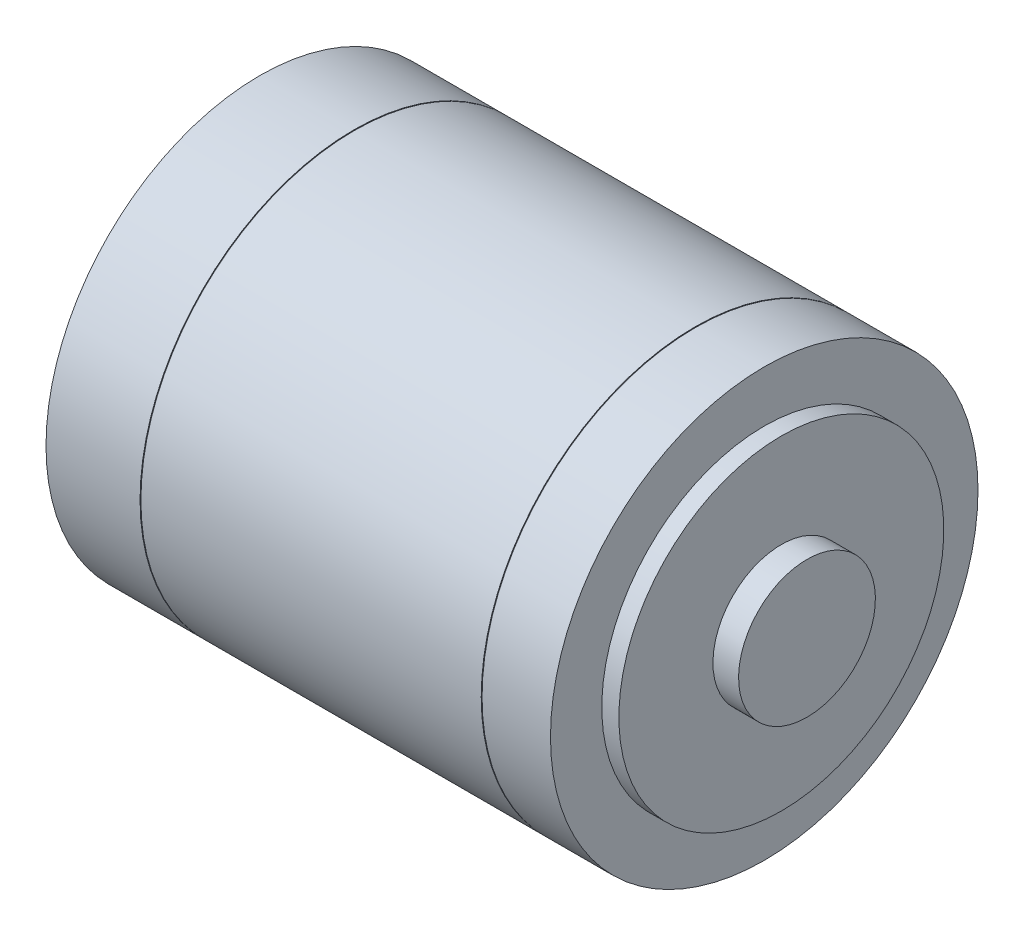
ISO-10303-21;
HEADER;
FILE_DESCRIPTION(('STEP AP214'),'2;1');
FILE_NAME('part.step','',(''),(''),'','','');
FILE_SCHEMA(('AUTOMOTIVE_DESIGN { 1 0 10303 214 1 1 1 1 }'));
ENDSEC;
DATA;
#1=APPLICATION_CONTEXT('core data for automotive mechanical design processes');
#2=APPLICATION_PROTOCOL_DEFINITION('international standard','automotive_design',2000,#1);
#3=PRODUCT_CONTEXT('',#1,'mechanical');
#4=PRODUCT('Part','Part','',(#3));
#5=PRODUCT_RELATED_PRODUCT_CATEGORY('part','',(#4));
#6=PRODUCT_DEFINITION_FORMATION('','',#4);
#7=PRODUCT_DEFINITION_CONTEXT('part definition',#1,'design');
#8=PRODUCT_DEFINITION('design','',#6,#7);
#9=PRODUCT_DEFINITION_SHAPE('','',#8);
#10=(LENGTH_UNIT() NAMED_UNIT(*) SI_UNIT(.MILLI.,.METRE.));
#11=(NAMED_UNIT(*) PLANE_ANGLE_UNIT() SI_UNIT($,.RADIAN.));
#12=(NAMED_UNIT(*) SI_UNIT($,.STERADIAN.) SOLID_ANGLE_UNIT());
#13=UNCERTAINTY_MEASURE_WITH_UNIT(LENGTH_MEASURE(1.E-05),#10,'distance_accuracy_value','');
#14=(GEOMETRIC_REPRESENTATION_CONTEXT(3) GLOBAL_UNCERTAINTY_ASSIGNED_CONTEXT((#13)) GLOBAL_UNIT_ASSIGNED_CONTEXT((#10,
#11,#12)) REPRESENTATION_CONTEXT('',''));
#15=CARTESIAN_POINT('',(0.,0.,0.));
#16=DIRECTION('',(0.,0.,1.));
#17=DIRECTION('',(1.,0.,0.));
#18=AXIS2_PLACEMENT_3D('',#15,#16,#17);
#19=CARTESIAN_POINT('',(-64.,15.,0.));
#20=DIRECTION('',(1.,0.,0.));
#21=DIRECTION('',(0.,1.,0.));
#22=AXIS2_PLACEMENT_3D('',#19,#20,#21);
#23=PLANE('',#22);
#24=CARTESIAN_POINT('',(-64.,-9.99999999999983,-17.3205080756889));
#25=DIRECTION('',(-1.,0.,0.));
#26=DIRECTION('',(0.,0.,1.));
#27=AXIS2_PLACEMENT_3D('',#24,#25,#26);
#28=CIRCLE('',#27,2.09999999999999);
#29=CARTESIAN_POINT('',(-64.,-9.99999999999983,-15.2205080756889));
#30=VERTEX_POINT('',#29);
#31=EDGE_CURVE('E83',#30,#30,#28,.T.);
#32=ORIENTED_EDGE('',*,*,#31,.F.);
#33=EDGE_LOOP('',(#32));
#34=FACE_BOUND('',#33,.T.);
#35=CARTESIAN_POINT('',(-64.,-10.0000000000001,17.3205080756888));
#36=DIRECTION('',(-1.,0.,0.));
#37=DIRECTION('',(0.,0.,1.));
#38=AXIS2_PLACEMENT_3D('',#35,#36,#37);
#39=CIRCLE('',#38,2.09999999999999);
#40=CARTESIAN_POINT('',(-64.,-10.0000000000001,19.4205080756888));
#41=VERTEX_POINT('',#40);
#42=EDGE_CURVE('E95',#41,#41,#39,.T.);
#43=ORIENTED_EDGE('',*,*,#42,.F.);
#44=EDGE_LOOP('',(#43));
#45=FACE_BOUND('',#44,.T.);
#46=CARTESIAN_POINT('',(-64.,0.,0.));
#47=DIRECTION('',(-1.,0.,0.));
#48=DIRECTION('',(0.,-1.,0.));
#49=AXIS2_PLACEMENT_3D('',#46,#47,#48);
#50=CIRCLE('',#49,25.);
#51=CARTESIAN_POINT('',(-64.,-25.,0.));
#52=VERTEX_POINT('',#51);
#53=EDGE_CURVE('E113',#52,#52,#50,.T.);
#54=ORIENTED_EDGE('',*,*,#53,.T.);
#55=EDGE_LOOP('',(#54));
#56=FACE_BOUND('',#55,.T.);
#57=CARTESIAN_POINT('',(-64.,0.,0.));
#58=DIRECTION('',(-1.,0.,0.));
#59=DIRECTION('',(0.,-1.,0.));
#60=AXIS2_PLACEMENT_3D('',#57,#58,#59);
#61=CIRCLE('',#60,15.);
#62=CARTESIAN_POINT('',(-64.,-15.,0.));
#63=VERTEX_POINT('',#62);
#64=EDGE_CURVE('E110',#63,#63,#61,.T.);
#65=ORIENTED_EDGE('',*,*,#64,.F.);
#66=EDGE_LOOP('',(#65));
#67=FACE_BOUND('',#66,.T.);
#68=CARTESIAN_POINT('',(-64.,20.,0.));
#69=DIRECTION('',(-1.,0.,0.));
#70=DIRECTION('',(0.,0.,1.));
#71=AXIS2_PLACEMENT_3D('',#68,#69,#70);
#72=CIRCLE('',#71,2.09999999999999);
#73=CARTESIAN_POINT('',(-64.,20.,2.10000000000001));
#74=VERTEX_POINT('',#73);
#75=EDGE_CURVE('E107',#74,#74,#72,.T.);
#76=ORIENTED_EDGE('',*,*,#75,.F.);
#77=EDGE_LOOP('',(#76));
#78=FACE_BOUND('',#77,.T.);
#79=CARTESIAN_POINT('',(-64.,9.99999999999995,17.3205080756889));
#80=DIRECTION('',(-1.,0.,0.));
#81=DIRECTION('',(0.,0.,1.));
#82=AXIS2_PLACEMENT_3D('',#79,#80,#81);
#83=CIRCLE('',#82,2.09999999999999);
#84=CARTESIAN_POINT('',(-64.,9.99999999999995,19.4205080756889));
#85=VERTEX_POINT('',#84);
#86=EDGE_CURVE('E101',#85,#85,#83,.T.);
#87=ORIENTED_EDGE('',*,*,#86,.F.);
#88=EDGE_LOOP('',(#87));
#89=FACE_BOUND('',#88,.T.);
#90=CARTESIAN_POINT('',(-64.,-20.,-1.37643350067595E-13));
#91=DIRECTION('',(-1.,0.,0.));
#92=DIRECTION('',(0.,0.,1.));
#93=AXIS2_PLACEMENT_3D('',#90,#91,#92);
#94=CIRCLE('',#93,2.09999999999999);
#95=CARTESIAN_POINT('',(-64.,-20.,2.09999999999986));
#96=VERTEX_POINT('',#95);
#97=EDGE_CURVE('E89',#96,#96,#94,.T.);
#98=ORIENTED_EDGE('',*,*,#97,.F.);
#99=EDGE_LOOP('',(#98));
#100=FACE_BOUND('',#99,.T.);
#101=CARTESIAN_POINT('',(-64.,10.0000000000002,-17.3205080756887));
#102=DIRECTION('',(-1.,0.,0.));
#103=DIRECTION('',(0.,0.,1.));
#104=AXIS2_PLACEMENT_3D('',#101,#102,#103);
#105=CIRCLE('',#104,2.09999999999999);
#106=CARTESIAN_POINT('',(-64.,10.0000000000002,-15.2205080756887));
#107=VERTEX_POINT('',#106);
#108=EDGE_CURVE('E75',#107,#107,#105,.T.);
#109=ORIENTED_EDGE('',*,*,#108,.F.);
#110=EDGE_LOOP('',(#109));
#111=FACE_BOUND('',#110,.T.);
#112=ADVANCED_FACE('F37',(#34,#45,#56,#67,#78,#89,#100,#111),#23,.F.);
#113=CARTESIAN_POINT('',(0.,8.00000000000001,0.));
#114=DIRECTION('',(-1.,0.,0.));
#115=DIRECTION('',(0.,-1.,0.));
#116=AXIS2_PLACEMENT_3D('',#113,#114,#115);
#117=PLANE('',#116);
#118=CARTESIAN_POINT('',(0.,0.,0.));
#119=DIRECTION('',(-1.,0.,0.));
#120=DIRECTION('',(0.,-1.,0.));
#121=AXIS2_PLACEMENT_3D('',#118,#119,#120);
#122=CIRCLE('',#121,8.);
#123=CARTESIAN_POINT('',(0.,-8.,0.));
#124=VERTEX_POINT('',#123);
#125=EDGE_CURVE('E152',#124,#124,#122,.T.);
#126=ORIENTED_EDGE('',*,*,#125,.F.);
#127=EDGE_LOOP('',(#126));
#128=FACE_BOUND('',#127,.T.);
#129=ADVANCED_FACE('F197',(#128),#117,.F.);
#130=CARTESIAN_POINT('',(-92.,0.,0.));
#131=DIRECTION('',(-1.,0.,0.));
#132=DIRECTION('',(0.,-1.,0.));
#133=AXIS2_PLACEMENT_3D('',#130,#131,#132);
#134=CYLINDRICAL_SURFACE('',#133,8.);
#135=CARTESIAN_POINT('',(-3.,0.,0.));
#136=DIRECTION('',(-1.,0.,0.));
#137=DIRECTION('',(0.,-1.,0.));
#138=AXIS2_PLACEMENT_3D('',#135,#136,#137);
#139=CIRCLE('',#138,8.);
#140=CARTESIAN_POINT('',(-2.99999999999999,-8.,0.));
#141=VERTEX_POINT('',#140);
#142=EDGE_CURVE('E149',#141,#141,#139,.T.);
#143=ORIENTED_EDGE('',*,*,#142,.F.);
#144=EDGE_LOOP('',(#143));
#145=FACE_BOUND('',#144,.T.);
#146=ORIENTED_EDGE('',*,*,#125,.T.);
#147=EDGE_LOOP('',(#146));
#148=FACE_BOUND('',#147,.T.);
#149=ADVANCED_FACE('F203',(#145,#148),#134,.T.);
#150=CARTESIAN_POINT('',(-3.,19.,0.));
#151=DIRECTION('',(-1.,0.,0.));
#152=DIRECTION('',(0.,-1.,0.));
#153=AXIS2_PLACEMENT_3D('',#150,#151,#152);
#154=PLANE('',#153);
#155=CARTESIAN_POINT('',(-3.,0.,0.));
#156=DIRECTION('',(-1.,0.,0.));
#157=DIRECTION('',(0.,-1.,0.));
#158=AXIS2_PLACEMENT_3D('',#155,#156,#157);
#159=CIRCLE('',#158,19.);
#160=CARTESIAN_POINT('',(-2.99999999999998,-19.,0.));
#161=VERTEX_POINT('',#160);
#162=EDGE_CURVE('E146',#161,#161,#159,.T.);
#163=ORIENTED_EDGE('',*,*,#162,.F.);
#164=EDGE_LOOP('',(#163));
#165=FACE_BOUND('',#164,.T.);
#166=ORIENTED_EDGE('',*,*,#142,.T.);
#167=EDGE_LOOP('',(#166));
#168=FACE_BOUND('',#167,.T.);
#169=ADVANCED_FACE('F255',(#165,#168),#154,.F.);
#170=CARTESIAN_POINT('',(-92.,0.,0.));
#171=DIRECTION('',(-1.,0.,0.));
#172=DIRECTION('',(0.,-1.,0.));
#173=AXIS2_PLACEMENT_3D('',#170,#171,#172);
#174=CYLINDRICAL_SURFACE('',#173,19.);
#175=CARTESIAN_POINT('',(-5.,0.,0.));
#176=DIRECTION('',(-1.,0.,0.));
#177=DIRECTION('',(0.,-1.,0.));
#178=AXIS2_PLACEMENT_3D('',#175,#176,#177);
#179=CIRCLE('',#178,19.);
#180=CARTESIAN_POINT('',(-4.99999999999998,-19.,0.));
#181=VERTEX_POINT('',#180);
#182=EDGE_CURVE('E143',#181,#181,#179,.T.);
#183=ORIENTED_EDGE('',*,*,#182,.F.);
#184=EDGE_LOOP('',(#183));
#185=FACE_BOUND('',#184,.T.);
#186=ORIENTED_EDGE('',*,*,#162,.T.);
#187=EDGE_LOOP('',(#186));
#188=FACE_BOUND('',#187,.T.);
#189=ADVANCED_FACE('F251',(#185,#188),#174,.T.);
#190=CARTESIAN_POINT('',(-5.,25.,0.));
#191=DIRECTION('',(-1.,0.,0.));
#192=DIRECTION('',(0.,-1.,0.));
#193=AXIS2_PLACEMENT_3D('',#190,#191,#192);
#194=PLANE('',#193);
#195=CARTESIAN_POINT('',(-5.,0.,0.));
#196=DIRECTION('',(-1.,0.,0.));
#197=DIRECTION('',(0.,-1.,0.));
#198=AXIS2_PLACEMENT_3D('',#195,#196,#197);
#199=CIRCLE('',#198,25.);
#200=CARTESIAN_POINT('',(-4.99999999999998,-25.,0.));
#201=VERTEX_POINT('',#200);
#202=EDGE_CURVE('E140',#201,#201,#199,.T.);
#203=ORIENTED_EDGE('',*,*,#202,.F.);
#204=EDGE_LOOP('',(#203));
#205=FACE_BOUND('',#204,.T.);
#206=ORIENTED_EDGE('',*,*,#182,.T.);
#207=EDGE_LOOP('',(#206));
#208=FACE_BOUND('',#207,.T.);
#209=ADVANCED_FACE('F247',(#205,#208),#194,.F.);
#210=CARTESIAN_POINT('',(-92.,0.,0.));
#211=DIRECTION('',(-1.,0.,0.));
#212=DIRECTION('',(0.,-1.,0.));
#213=AXIS2_PLACEMENT_3D('',#210,#211,#212);
#214=CYLINDRICAL_SURFACE('',#213,25.);
#215=CARTESIAN_POINT('',(-13.,0.,0.));
#216=DIRECTION('',(-1.,0.,0.));
#217=DIRECTION('',(0.,-1.,0.));
#218=AXIS2_PLACEMENT_3D('',#215,#216,#217);
#219=CIRCLE('',#218,25.);
#220=CARTESIAN_POINT('',(-13.,-25.,0.));
#221=VERTEX_POINT('',#220);
#222=EDGE_CURVE('E137',#221,#221,#219,.T.);
#223=ORIENTED_EDGE('',*,*,#222,.F.);
#224=EDGE_LOOP('',(#223));
#225=FACE_BOUND('',#224,.T.);
#226=ORIENTED_EDGE('',*,*,#202,.T.);
#227=EDGE_LOOP('',(#226));
#228=FACE_BOUND('',#227,.T.);
#229=ADVANCED_FACE('F243',(#225,#228),#214,.T.);
#230=CARTESIAN_POINT('',(-13.,24.9,0.));
#231=DIRECTION('',(1.,0.,0.));
#232=DIRECTION('',(0.,1.,0.));
#233=AXIS2_PLACEMENT_3D('',#230,#231,#232);
#234=PLANE('',#233);
#235=CARTESIAN_POINT('',(-13.,0.,0.));
#236=DIRECTION('',(-1.,0.,0.));
#237=DIRECTION('',(0.,-1.,0.));
#238=AXIS2_PLACEMENT_3D('',#235,#236,#237);
#239=CIRCLE('',#238,24.9);
#240=CARTESIAN_POINT('',(-13.,-24.9,0.));
#241=VERTEX_POINT('',#240);
#242=EDGE_CURVE('E134',#241,#241,#239,.T.);
#243=ORIENTED_EDGE('',*,*,#242,.F.);
#244=EDGE_LOOP('',(#243));
#245=FACE_BOUND('',#244,.T.);
#246=ORIENTED_EDGE('',*,*,#222,.T.);
#247=EDGE_LOOP('',(#246));
#248=FACE_BOUND('',#247,.T.);
#249=ADVANCED_FACE('F239',(#245,#248),#234,.F.);
#250=CARTESIAN_POINT('',(-92.,0.,0.));
#251=DIRECTION('',(-1.,0.,0.));
#252=DIRECTION('',(0.,-1.,0.));
#253=AXIS2_PLACEMENT_3D('',#250,#251,#252);
#254=CYLINDRICAL_SURFACE('',#253,24.9);
#255=CARTESIAN_POINT('',(-13.1,0.,0.));
#256=DIRECTION('',(-1.,0.,0.));
#257=DIRECTION('',(0.,-1.,0.));
#258=AXIS2_PLACEMENT_3D('',#255,#256,#257);
#259=CIRCLE('',#258,24.9);
#260=CARTESIAN_POINT('',(-13.1,-24.9,0.));
#261=VERTEX_POINT('',#260);
#262=EDGE_CURVE('E131',#261,#261,#259,.T.);
#263=ORIENTED_EDGE('',*,*,#262,.F.);
#264=EDGE_LOOP('',(#263));
#265=FACE_BOUND('',#264,.T.);
#266=ORIENTED_EDGE('',*,*,#242,.T.);
#267=EDGE_LOOP('',(#266));
#268=FACE_BOUND('',#267,.T.);
#269=ADVANCED_FACE('F235',(#265,#268),#254,.T.);
#270=CARTESIAN_POINT('',(-13.1,25.,0.));
#271=DIRECTION('',(-1.,0.,0.));
#272=DIRECTION('',(0.,-1.,0.));
#273=AXIS2_PLACEMENT_3D('',#270,#271,#272);
#274=PLANE('',#273);
#275=CARTESIAN_POINT('',(-13.1,0.,0.));
#276=DIRECTION('',(-1.,0.,0.));
#277=DIRECTION('',(0.,-1.,0.));
#278=AXIS2_PLACEMENT_3D('',#275,#276,#277);
#279=CIRCLE('',#278,25.);
#280=CARTESIAN_POINT('',(-13.1,-25.,0.));
#281=VERTEX_POINT('',#280);
#282=EDGE_CURVE('E128',#281,#281,#279,.T.);
#283=ORIENTED_EDGE('',*,*,#282,.F.);
#284=EDGE_LOOP('',(#283));
#285=FACE_BOUND('',#284,.T.);
#286=ORIENTED_EDGE('',*,*,#262,.T.);
#287=EDGE_LOOP('',(#286));
#288=FACE_BOUND('',#287,.T.);
#289=ADVANCED_FACE('F231',(#285,#288),#274,.F.);
#290=CARTESIAN_POINT('',(-92.,0.,0.));
#291=DIRECTION('',(-1.,0.,0.));
#292=DIRECTION('',(0.,-1.,0.));
#293=AXIS2_PLACEMENT_3D('',#290,#291,#292);
#294=CYLINDRICAL_SURFACE('',#293,25.);
#295=CARTESIAN_POINT('',(-52.9000000000003,0.,0.));
#296=DIRECTION('',(-1.,0.,0.));
#297=DIRECTION('',(0.,-1.,0.));
#298=AXIS2_PLACEMENT_3D('',#295,#296,#297);
#299=CIRCLE('',#298,25.);
#300=CARTESIAN_POINT('',(-52.9000000000002,-25.,0.));
#301=VERTEX_POINT('',#300);
#302=EDGE_CURVE('E125',#301,#301,#299,.T.);
#303=ORIENTED_EDGE('',*,*,#302,.F.);
#304=EDGE_LOOP('',(#303));
#305=FACE_BOUND('',#304,.T.);
#306=ORIENTED_EDGE('',*,*,#282,.T.);
#307=EDGE_LOOP('',(#306));
#308=FACE_BOUND('',#307,.T.);
#309=ADVANCED_FACE('F227',(#305,#308),#294,.T.);
#310=CARTESIAN_POINT('',(-52.9000000000003,24.9,0.));
#311=DIRECTION('',(1.,0.,0.));
#312=DIRECTION('',(0.,1.,0.));
#313=AXIS2_PLACEMENT_3D('',#310,#311,#312);
#314=PLANE('',#313);
#315=CARTESIAN_POINT('',(-52.9000000000003,0.,0.));
#316=DIRECTION('',(-1.,0.,0.));
#317=DIRECTION('',(0.,-1.,0.));
#318=AXIS2_PLACEMENT_3D('',#315,#316,#317);
#319=CIRCLE('',#318,24.9);
#320=CARTESIAN_POINT('',(-52.9000000000002,-24.9,0.));
#321=VERTEX_POINT('',#320);
#322=EDGE_CURVE('E122',#321,#321,#319,.T.);
#323=ORIENTED_EDGE('',*,*,#322,.F.);
#324=EDGE_LOOP('',(#323));
#325=FACE_BOUND('',#324,.T.);
#326=ORIENTED_EDGE('',*,*,#302,.T.);
#327=EDGE_LOOP('',(#326));
#328=FACE_BOUND('',#327,.T.);
#329=ADVANCED_FACE('F223',(#325,#328),#314,.F.);
#330=CARTESIAN_POINT('',(-92.,0.,0.));
#331=DIRECTION('',(-1.,0.,0.));
#332=DIRECTION('',(0.,-1.,0.));
#333=AXIS2_PLACEMENT_3D('',#330,#331,#332);
#334=CYLINDRICAL_SURFACE('',#333,24.9);
#335=CARTESIAN_POINT('',(-53.0000000000003,0.,0.));
#336=DIRECTION('',(-1.,0.,0.));
#337=DIRECTION('',(0.,-1.,0.));
#338=AXIS2_PLACEMENT_3D('',#335,#336,#337);
#339=CIRCLE('',#338,24.9);
#340=CARTESIAN_POINT('',(-53.0000000000002,-24.9,0.));
#341=VERTEX_POINT('',#340);
#342=EDGE_CURVE('E119',#341,#341,#339,.T.);
#343=ORIENTED_EDGE('',*,*,#342,.F.);
#344=EDGE_LOOP('',(#343));
#345=FACE_BOUND('',#344,.T.);
#346=ORIENTED_EDGE('',*,*,#322,.T.);
#347=EDGE_LOOP('',(#346));
#348=FACE_BOUND('',#347,.T.);
#349=ADVANCED_FACE('F219',(#345,#348),#334,.T.);
#350=CARTESIAN_POINT('',(-53.0000000000003,25.,0.));
#351=DIRECTION('',(-1.,0.,0.));
#352=DIRECTION('',(0.,-1.,0.));
#353=AXIS2_PLACEMENT_3D('',#350,#351,#352);
#354=PLANE('',#353);
#355=CARTESIAN_POINT('',(-53.0000000000003,0.,0.));
#356=DIRECTION('',(-1.,0.,0.));
#357=DIRECTION('',(0.,-1.,0.));
#358=AXIS2_PLACEMENT_3D('',#355,#356,#357);
#359=CIRCLE('',#358,25.);
#360=CARTESIAN_POINT('',(-53.0000000000002,-25.,0.));
#361=VERTEX_POINT('',#360);
#362=EDGE_CURVE('E116',#361,#361,#359,.T.);
#363=ORIENTED_EDGE('',*,*,#362,.F.);
#364=EDGE_LOOP('',(#363));
#365=FACE_BOUND('',#364,.T.);
#366=ORIENTED_EDGE('',*,*,#342,.T.);
#367=EDGE_LOOP('',(#366));
#368=FACE_BOUND('',#367,.T.);
#369=ADVANCED_FACE('F215',(#365,#368),#354,.F.);
#370=CARTESIAN_POINT('',(-92.,0.,0.));
#371=DIRECTION('',(-1.,0.,0.));
#372=DIRECTION('',(0.,-1.,0.));
#373=AXIS2_PLACEMENT_3D('',#370,#371,#372);
#374=CYLINDRICAL_SURFACE('',#373,25.);
#375=ORIENTED_EDGE('',*,*,#53,.F.);
#376=EDGE_LOOP('',(#375));
#377=FACE_BOUND('',#376,.T.);
#378=ORIENTED_EDGE('',*,*,#362,.T.);
#379=EDGE_LOOP('',(#378));
#380=FACE_BOUND('',#379,.T.);
#381=ADVANCED_FACE('F212',(#377,#380),#374,.T.);
#382=CARTESIAN_POINT('',(-92.,0.,0.));
#383=DIRECTION('',(-1.,0.,0.));
#384=DIRECTION('',(0.,-1.,0.));
#385=AXIS2_PLACEMENT_3D('',#382,#383,#384);
#386=CYLINDRICAL_SURFACE('',#385,15.);
#387=CARTESIAN_POINT('',(-66.5,0.,0.));
#388=DIRECTION('',(1.,0.,0.));
#389=DIRECTION('',(0.,1.,0.));
#390=AXIS2_PLACEMENT_3D('',#387,#388,#389);
#391=CIRCLE('',#390,15.);
#392=CARTESIAN_POINT('',(-66.5,15.,0.));
#393=VERTEX_POINT('',#392);
#394=EDGE_CURVE('E11',#393,#393,#391,.T.);
#395=ORIENTED_EDGE('',*,*,#394,.T.);
#396=EDGE_LOOP('',(#395));
#397=FACE_BOUND('',#396,.T.);
#398=ORIENTED_EDGE('',*,*,#64,.T.);
#399=EDGE_LOOP('',(#398));
#400=FACE_BOUND('',#399,.T.);
#401=ADVANCED_FACE('F210',(#397,#400),#386,.T.);
#402=CARTESIAN_POINT('',(-67.,0.,0.));
#403=DIRECTION('',(1.,0.,0.));
#404=DIRECTION('',(0.,1.,0.));
#405=AXIS2_PLACEMENT_3D('',#402,#403,#404);
#406=PLANE('',#405);
#407=CARTESIAN_POINT('',(-67.,0.,0.));
#408=DIRECTION('',(1.,0.,0.));
#409=DIRECTION('',(0.,1.,0.));
#410=AXIS2_PLACEMENT_3D('',#407,#408,#409);
#411=CIRCLE('',#410,14.5);
#412=CARTESIAN_POINT('',(-67.,14.5,0.));
#413=VERTEX_POINT('',#412);
#414=EDGE_CURVE('E46',#413,#413,#411,.F.);
#415=ORIENTED_EDGE('',*,*,#414,.T.);
#416=EDGE_LOOP('',(#415));
#417=FACE_BOUND('',#416,.T.);
#418=ADVANCED_FACE('F187',(#417),#406,.F.);
#419=CARTESIAN_POINT('',(-64.,20.,0.));
#420=DIRECTION('',(-1.,0.,0.));
#421=DIRECTION('',(0.,0.,1.));
#422=AXIS2_PLACEMENT_3D('',#419,#420,#421);
#423=CYLINDRICAL_SURFACE('',#422,2.09999999999999);
#424=CARTESIAN_POINT('',(-50.0000000000003,20.,0.));
#425=DIRECTION('',(-1.,0.,0.));
#426=DIRECTION('',(0.,0.,1.));
#427=AXIS2_PLACEMENT_3D('',#424,#425,#426);
#428=CIRCLE('',#427,2.09999999999999);
#429=CARTESIAN_POINT('',(-50.0000000000003,20.,2.1));
#430=VERTEX_POINT('',#429);
#431=EDGE_CURVE('E104',#430,#430,#428,.T.);
#432=ORIENTED_EDGE('',*,*,#431,.F.);
#433=EDGE_LOOP('',(#432));
#434=FACE_BOUND('',#433,.T.);
#435=ORIENTED_EDGE('',*,*,#75,.T.);
#436=EDGE_LOOP('',(#435));
#437=FACE_BOUND('',#436,.T.);
#438=ADVANCED_FACE('F489',(#434,#437),#423,.F.);
#439=CARTESIAN_POINT('',(-50.0000000000003,20.,0.));
#440=DIRECTION('',(-1.,0.,0.));
#441=DIRECTION('',(0.,0.,1.));
#442=AXIS2_PLACEMENT_3D('',#439,#440,#441);
#443=CONICAL_SURFACE('',#442,2.09999999999999,1.04719755119659);
#444=CARTESIAN_POINT('',(-48.7875644347021,20.,0.));
#445=VERTEX_POINT('',#444);
#446=VERTEX_LOOP('',#445);
#447=FACE_BOUND('',#446,.T.);
#448=ORIENTED_EDGE('',*,*,#431,.T.);
#449=EDGE_LOOP('',(#448));
#450=FACE_BOUND('',#449,.T.);
#451=ADVANCED_FACE('F478',(#447,#450),#443,.F.);
#452=CARTESIAN_POINT('',(-64.,9.99999999999995,17.3205080756889));
#453=DIRECTION('',(-1.,0.,0.));
#454=DIRECTION('',(0.,0.,1.));
#455=AXIS2_PLACEMENT_3D('',#452,#453,#454);
#456=CYLINDRICAL_SURFACE('',#455,2.09999999999999);
#457=CARTESIAN_POINT('',(-50.0000000000003,9.99999999999995,17.3205080756889));
#458=DIRECTION('',(-1.,0.,0.));
#459=DIRECTION('',(0.,0.,1.));
#460=AXIS2_PLACEMENT_3D('',#457,#458,#459);
#461=CIRCLE('',#460,2.09999999999999);
#462=CARTESIAN_POINT('',(-50.0000000000003,9.99999999999995,19.4205080756889));
#463=VERTEX_POINT('',#462);
#464=EDGE_CURVE('E98',#463,#463,#461,.T.);
#465=ORIENTED_EDGE('',*,*,#464,.F.);
#466=EDGE_LOOP('',(#465));
#467=FACE_BOUND('',#466,.T.);
#468=ORIENTED_EDGE('',*,*,#86,.T.);
#469=EDGE_LOOP('',(#468));
#470=FACE_BOUND('',#469,.T.);
#471=ADVANCED_FACE('F469',(#467,#470),#456,.F.);
#472=CARTESIAN_POINT('',(-50.0000000000003,9.99999999999995,17.3205080756889));
#473=DIRECTION('',(-1.,0.,0.));
#474=DIRECTION('',(0.,0.,1.));
#475=AXIS2_PLACEMENT_3D('',#472,#473,#474);
#476=CONICAL_SURFACE('',#475,2.09999999999999,1.04719755119659);
#477=CARTESIAN_POINT('',(-48.7875644347021,9.99999999999995,17.3205080756889));
#478=VERTEX_POINT('',#477);
#479=VERTEX_LOOP('',#478);
#480=FACE_BOUND('',#479,.T.);
#481=ORIENTED_EDGE('',*,*,#464,.T.);
#482=EDGE_LOOP('',(#481));
#483=FACE_BOUND('',#482,.T.);
#484=ADVANCED_FACE('F459',(#480,#483),#476,.F.);
#485=CARTESIAN_POINT('',(-64.,-10.0000000000001,17.3205080756888));
#486=DIRECTION('',(-1.,0.,0.));
#487=DIRECTION('',(0.,0.,1.));
#488=AXIS2_PLACEMENT_3D('',#485,#486,#487);
#489=CYLINDRICAL_SURFACE('',#488,2.09999999999999);
#490=CARTESIAN_POINT('',(-50.,-10.0000000000001,17.3205080756888));
#491=DIRECTION('',(-1.,0.,0.));
#492=DIRECTION('',(0.,0.,1.));
#493=AXIS2_PLACEMENT_3D('',#490,#491,#492);
#494=CIRCLE('',#493,2.09999999999999);
#495=CARTESIAN_POINT('',(-50.,-10.0000000000001,19.4205080756888));
#496=VERTEX_POINT('',#495);
#497=EDGE_CURVE('E92',#496,#496,#494,.T.);
#498=ORIENTED_EDGE('',*,*,#497,.F.);
#499=EDGE_LOOP('',(#498));
#500=FACE_BOUND('',#499,.T.);
#501=ORIENTED_EDGE('',*,*,#42,.T.);
#502=EDGE_LOOP('',(#501));
#503=FACE_BOUND('',#502,.T.);
#504=ADVANCED_FACE('F449',(#500,#503),#489,.F.);
#505=CARTESIAN_POINT('',(-50.,-10.0000000000001,17.3205080756888));
#506=DIRECTION('',(-1.,0.,0.));
#507=DIRECTION('',(0.,0.,1.));
#508=AXIS2_PLACEMENT_3D('',#505,#506,#507);
#509=CONICAL_SURFACE('',#508,2.09999999999999,1.04719755119659);
#510=CARTESIAN_POINT('',(-48.7875644347018,-10.0000000000001,17.3205080756888));
#511=VERTEX_POINT('',#510);
#512=VERTEX_LOOP('',#511);
#513=FACE_BOUND('',#512,.T.);
#514=ORIENTED_EDGE('',*,*,#497,.T.);
#515=EDGE_LOOP('',(#514));
#516=FACE_BOUND('',#515,.T.);
#517=ADVANCED_FACE('F439',(#513,#516),#509,.F.);
#518=CARTESIAN_POINT('',(-64.,-20.,-1.37643350067595E-13));
#519=DIRECTION('',(-1.,0.,0.));
#520=DIRECTION('',(0.,0.,1.));
#521=AXIS2_PLACEMENT_3D('',#518,#519,#520);
#522=CYLINDRICAL_SURFACE('',#521,2.09999999999999);
#523=CARTESIAN_POINT('',(-50.,-20.,-1.38941759434776E-13));
#524=DIRECTION('',(-1.,0.,0.));
#525=DIRECTION('',(0.,0.,1.));
#526=AXIS2_PLACEMENT_3D('',#523,#524,#525);
#527=CIRCLE('',#526,2.09999999999999);
#528=CARTESIAN_POINT('',(-50.,-20.,2.09999999999986));
#529=VERTEX_POINT('',#528);
#530=EDGE_CURVE('E86',#529,#529,#527,.T.);
#531=ORIENTED_EDGE('',*,*,#530,.F.);
#532=EDGE_LOOP('',(#531));
#533=FACE_BOUND('',#532,.T.);
#534=ORIENTED_EDGE('',*,*,#97,.T.);
#535=EDGE_LOOP('',(#534));
#536=FACE_BOUND('',#535,.T.);
#537=ADVANCED_FACE('F429',(#533,#536),#522,.F.);
#538=CARTESIAN_POINT('',(-50.,-20.,-1.38941759434776E-13));
#539=DIRECTION('',(-1.,0.,0.));
#540=DIRECTION('',(0.,0.,1.));
#541=AXIS2_PLACEMENT_3D('',#538,#539,#540);
#542=CONICAL_SURFACE('',#541,2.09999999999999,1.04719755119659);
#543=CARTESIAN_POINT('',(-48.7875644347018,-20.,-1.39054204984424E-13));
#544=VERTEX_POINT('',#543);
#545=VERTEX_LOOP('',#544);
#546=FACE_BOUND('',#545,.T.);
#547=ORIENTED_EDGE('',*,*,#530,.T.);
#548=EDGE_LOOP('',(#547));
#549=FACE_BOUND('',#548,.T.);
#550=ADVANCED_FACE('F419',(#546,#549),#542,.F.);
#551=CARTESIAN_POINT('',(-64.,-9.99999999999983,-17.3205080756889));
#552=DIRECTION('',(-1.,0.,0.));
#553=DIRECTION('',(0.,0.,1.));
#554=AXIS2_PLACEMENT_3D('',#551,#552,#553);
#555=CYLINDRICAL_SURFACE('',#554,2.09999999999999);
#556=CARTESIAN_POINT('',(-50.,-9.99999999999983,-17.3205080756889));
#557=DIRECTION('',(-1.,0.,0.));
#558=DIRECTION('',(0.,0.,1.));
#559=AXIS2_PLACEMENT_3D('',#556,#557,#558);
#560=CIRCLE('',#559,2.09999999999999);
#561=CARTESIAN_POINT('',(-50.,-9.99999999999983,-15.2205080756889));
#562=VERTEX_POINT('',#561);
#563=EDGE_CURVE('E78',#562,#562,#560,.T.);
#564=ORIENTED_EDGE('',*,*,#563,.F.);
#565=EDGE_LOOP('',(#564));
#566=FACE_BOUND('',#565,.T.);
#567=ORIENTED_EDGE('',*,*,#31,.T.);
#568=EDGE_LOOP('',(#567));
#569=FACE_BOUND('',#568,.T.);
#570=ADVANCED_FACE('F409',(#566,#569),#555,.F.);
#571=CARTESIAN_POINT('',(-50.,-9.99999999999983,-17.3205080756889));
#572=DIRECTION('',(-1.,0.,0.));
#573=DIRECTION('',(0.,0.,1.));
#574=AXIS2_PLACEMENT_3D('',#571,#572,#573);
#575=CONICAL_SURFACE('',#574,2.09999999999999,1.04719755119659);
#576=CARTESIAN_POINT('',(-48.7875644347018,-9.99999999999984,-17.3205080756889));
#577=VERTEX_POINT('',#576);
#578=VERTEX_LOOP('',#577);
#579=FACE_BOUND('',#578,.T.);
#580=ORIENTED_EDGE('',*,*,#563,.T.);
#581=EDGE_LOOP('',(#580));
#582=FACE_BOUND('',#581,.T.);
#583=ADVANCED_FACE('F400',(#579,#582),#575,.F.);
#584=CARTESIAN_POINT('',(-64.,10.0000000000002,-17.3205080756887));
#585=DIRECTION('',(-1.,0.,0.));
#586=DIRECTION('',(0.,0.,1.));
#587=AXIS2_PLACEMENT_3D('',#584,#585,#586);
#588=CYLINDRICAL_SURFACE('',#587,2.09999999999999);
#589=CARTESIAN_POINT('',(-50.0000000000003,10.0000000000002,-17.3205080756887));
#590=DIRECTION('',(-1.,0.,0.));
#591=DIRECTION('',(0.,0.,1.));
#592=AXIS2_PLACEMENT_3D('',#589,#590,#591);
#593=CIRCLE('',#592,2.09999999999999);
#594=CARTESIAN_POINT('',(-50.0000000000003,10.0000000000002,-15.2205080756887));
#595=VERTEX_POINT('',#594);
#596=EDGE_CURVE('E73',#595,#595,#593,.T.);
#597=ORIENTED_EDGE('',*,*,#596,.F.);
#598=EDGE_LOOP('',(#597));
#599=FACE_BOUND('',#598,.T.);
#600=ORIENTED_EDGE('',*,*,#108,.T.);
#601=EDGE_LOOP('',(#600));
#602=FACE_BOUND('',#601,.T.);
#603=ADVANCED_FACE('F69',(#599,#602),#588,.F.);
#604=CARTESIAN_POINT('',(-50.0000000000003,10.0000000000002,-17.3205080756887));
#605=DIRECTION('',(-1.,0.,0.));
#606=DIRECTION('',(0.,0.,1.));
#607=AXIS2_PLACEMENT_3D('',#604,#605,#606);
#608=CONICAL_SURFACE('',#607,2.09999999999999,1.04719755119659);
#609=CARTESIAN_POINT('',(-48.7875644347021,10.0000000000002,-17.3205080756887));
#610=VERTEX_POINT('',#609);
#611=VERTEX_LOOP('',#610);
#612=FACE_BOUND('',#611,.T.);
#613=ORIENTED_EDGE('',*,*,#596,.T.);
#614=EDGE_LOOP('',(#613));
#615=FACE_BOUND('',#614,.T.);
#616=ADVANCED_FACE('F65',(#612,#615),#608,.F.);
#617=CARTESIAN_POINT('',(-67.,0.,0.));
#618=DIRECTION('',(1.,0.,0.));
#619=DIRECTION('',(0.,1.,0.));
#620=AXIS2_PLACEMENT_3D('',#617,#618,#619);
#621=CONICAL_SURFACE('',#620,14.5,0.785398163397445);
#622=ORIENTED_EDGE('',*,*,#394,.F.);
#623=EDGE_LOOP('',(#622));
#624=FACE_BOUND('',#623,.T.);
#625=ORIENTED_EDGE('',*,*,#414,.F.);
#626=EDGE_LOOP('',(#625));
#627=FACE_BOUND('',#626,.T.);
#628=ADVANCED_FACE('F68',(#624,#627),#621,.T.);
#629=CLOSED_SHELL('',(#112,#129,#149,#169,#189,#209,#229,#249,#269,#289,#309,#329,#349,#369,
#381,#401,#418,#438,#451,#471,#484,#504,#517,#537,#550,#570,#583,#603,#616,#628));
#630=CARTESIAN_POINT('',(-56.0000000000003,15.,0.));
#631=DIRECTION('',(1.,0.,0.));
#632=DIRECTION('',(0.,1.,0.));
#633=AXIS2_PLACEMENT_3D('',#630,#631,#632);
#634=PLANE('',#633);
#635=CARTESIAN_POINT('',(-56.0000000000003,0.,0.));
#636=DIRECTION('',(1.,0.,0.));
#637=DIRECTION('',(0.,1.,0.));
#638=AXIS2_PLACEMENT_3D('',#635,#636,#637);
#639=CIRCLE('',#638,7.);
#640=CARTESIAN_POINT('',(-56.0000000000003,7.,0.));
#641=VERTEX_POINT('',#640);
#642=EDGE_CURVE('E159',#641,#641,#639,.F.);
#643=ORIENTED_EDGE('',*,*,#642,.T.);
#644=EDGE_LOOP('',(#643));
#645=FACE_BOUND('',#644,.T.);
#646=CARTESIAN_POINT('',(-56.0000000000003,0.,0.));
#647=DIRECTION('',(1.,0.,0.));
#648=DIRECTION('',(0.,1.,0.));
#649=AXIS2_PLACEMENT_3D('',#646,#647,#648);
#650=CIRCLE('',#649,16.9);
#651=CARTESIAN_POINT('',(-56.0000000000003,16.9,0.));
#652=VERTEX_POINT('',#651);
#653=EDGE_CURVE('E155',#652,#652,#650,.F.);
#654=ORIENTED_EDGE('',*,*,#653,.F.);
#655=EDGE_LOOP('',(#654));
#656=FACE_BOUND('',#655,.T.);
#657=ADVANCED_FACE('F263',(#645,#656),#634,.T.);
#658=CARTESIAN_POINT('',(-13.,25.,0.));
#659=DIRECTION('',(-1.,0.,0.));
#660=DIRECTION('',(0.,-1.,0.));
#661=AXIS2_PLACEMENT_3D('',#658,#659,#660);
#662=PLANE('',#661);
#663=CARTESIAN_POINT('',(-13.,0.,0.));
#664=DIRECTION('',(-1.,0.,0.));
#665=DIRECTION('',(0.,-1.,0.));
#666=AXIS2_PLACEMENT_3D('',#663,#664,#665);
#667=CIRCLE('',#666,11.);
#668=CARTESIAN_POINT('',(-13.,-11.,0.));
#669=VERTEX_POINT('',#668);
#670=EDGE_CURVE('E180',#669,#669,#667,.T.);
#671=ORIENTED_EDGE('',*,*,#670,.F.);
#672=EDGE_LOOP('',(#671));
#673=FACE_BOUND('',#672,.T.);
#674=CARTESIAN_POINT('',(-13.,0.,0.));
#675=DIRECTION('',(-1.,0.,0.));
#676=DIRECTION('',(0.,-1.,0.));
#677=AXIS2_PLACEMENT_3D('',#674,#675,#676);
#678=CIRCLE('',#677,16.9);
#679=CARTESIAN_POINT('',(-13.,-16.9,0.));
#680=VERTEX_POINT('',#679);
#681=EDGE_CURVE('E177',#680,#680,#678,.F.);
#682=ORIENTED_EDGE('',*,*,#681,.F.);
#683=EDGE_LOOP('',(#682));
#684=FACE_BOUND('',#683,.T.);
#685=ADVANCED_FACE('F265',(#673,#684),#662,.T.);
#686=CARTESIAN_POINT('',(-11.,19.,0.));
#687=DIRECTION('',(-1.,0.,0.));
#688=DIRECTION('',(0.,-1.,0.));
#689=AXIS2_PLACEMENT_3D('',#686,#687,#688);
#690=PLANE('',#689);
#691=CARTESIAN_POINT('',(-11.,0.,0.));
#692=DIRECTION('',(-1.,0.,0.));
#693=DIRECTION('',(0.,-1.,0.));
#694=AXIS2_PLACEMENT_3D('',#691,#692,#693);
#695=CIRCLE('',#694,11.);
#696=CARTESIAN_POINT('',(-11.,-11.,0.));
#697=VERTEX_POINT('',#696);
#698=EDGE_CURVE('E174',#697,#697,#695,.T.);
#699=ORIENTED_EDGE('',*,*,#698,.T.);
#700=EDGE_LOOP('',(#699));
#701=FACE_BOUND('',#700,.T.);
#702=ADVANCED_FACE('F270',(#701),#690,.T.);
#703=CARTESIAN_POINT('',(-92.,0.,0.));
#704=DIRECTION('',(-1.,0.,0.));
#705=DIRECTION('',(0.,-1.,0.));
#706=AXIS2_PLACEMENT_3D('',#703,#704,#705);
#707=CYLINDRICAL_SURFACE('',#706,11.);
#708=ORIENTED_EDGE('',*,*,#670,.T.);
#709=EDGE_LOOP('',(#708));
#710=FACE_BOUND('',#709,.T.);
#711=ORIENTED_EDGE('',*,*,#698,.F.);
#712=EDGE_LOOP('',(#711));
#713=FACE_BOUND('',#712,.T.);
#714=ADVANCED_FACE('F274',(#710,#713),#707,.F.);
#715=CARTESIAN_POINT('',(-92.,0.,0.));
#716=DIRECTION('',(-1.,0.,0.));
#717=DIRECTION('',(0.,-1.,0.));
#718=AXIS2_PLACEMENT_3D('',#715,#716,#717);
#719=CYLINDRICAL_SURFACE('',#718,16.9);
#720=ORIENTED_EDGE('',*,*,#681,.T.);
#721=EDGE_LOOP('',(#720));
#722=FACE_BOUND('',#721,.T.);
#723=CARTESIAN_POINT('',(-21.1,0.,0.));
#724=DIRECTION('',(-1.,0.,0.));
#725=DIRECTION('',(0.,-1.,0.));
#726=AXIS2_PLACEMENT_3D('',#723,#724,#725);
#727=CIRCLE('',#726,16.9);
#728=CARTESIAN_POINT('',(-21.1,-16.9,0.));
#729=VERTEX_POINT('',#728);
#730=EDGE_CURVE('E171',#729,#729,#727,.T.);
#731=ORIENTED_EDGE('',*,*,#730,.T.);
#732=EDGE_LOOP('',(#731));
#733=FACE_BOUND('',#732,.T.);
#734=ADVANCED_FACE('F278',(#722,#733),#719,.F.);
#735=CARTESIAN_POINT('',(-21.1,25.,0.));
#736=DIRECTION('',(-1.,0.,0.));
#737=DIRECTION('',(0.,-1.,0.));
#738=AXIS2_PLACEMENT_3D('',#735,#736,#737);
#739=PLANE('',#738);
#740=CARTESIAN_POINT('',(-21.1,0.,0.));
#741=DIRECTION('',(-1.,0.,0.));
#742=DIRECTION('',(0.,-1.,0.));
#743=AXIS2_PLACEMENT_3D('',#740,#741,#742);
#744=CIRCLE('',#743,17.);
#745=CARTESIAN_POINT('',(-21.1,-17.,0.));
#746=VERTEX_POINT('',#745);
#747=EDGE_CURVE('E168',#746,#746,#744,.T.);
#748=ORIENTED_EDGE('',*,*,#747,.T.);
#749=EDGE_LOOP('',(#748));
#750=FACE_BOUND('',#749,.T.);
#751=ORIENTED_EDGE('',*,*,#730,.F.);
#752=EDGE_LOOP('',(#751));
#753=FACE_BOUND('',#752,.T.);
#754=ADVANCED_FACE('F282',(#750,#753),#739,.T.);
#755=CARTESIAN_POINT('',(-92.,0.,0.));
#756=DIRECTION('',(-1.,0.,0.));
#757=DIRECTION('',(0.,-1.,0.));
#758=AXIS2_PLACEMENT_3D('',#755,#756,#757);
#759=CYLINDRICAL_SURFACE('',#758,17.);
#760=CARTESIAN_POINT('',(-44.9,0.,0.));
#761=DIRECTION('',(1.,0.,0.));
#762=DIRECTION('',(0.,1.,0.));
#763=AXIS2_PLACEMENT_3D('',#760,#761,#762);
#764=CIRCLE('',#763,17.);
#765=CARTESIAN_POINT('',(-44.9,17.,0.));
#766=VERTEX_POINT('',#765);
#767=EDGE_CURVE('E165',#766,#766,#764,.F.);
#768=ORIENTED_EDGE('',*,*,#767,.T.);
#769=EDGE_LOOP('',(#768));
#770=FACE_BOUND('',#769,.T.);
#771=ORIENTED_EDGE('',*,*,#747,.F.);
#772=EDGE_LOOP('',(#771));
#773=FACE_BOUND('',#772,.T.);
#774=ADVANCED_FACE('F286',(#770,#773),#759,.F.);
#775=CARTESIAN_POINT('',(-44.9,24.9,0.));
#776=DIRECTION('',(1.,0.,0.));
#777=DIRECTION('',(0.,1.,0.));
#778=AXIS2_PLACEMENT_3D('',#775,#776,#777);
#779=PLANE('',#778);
#780=CARTESIAN_POINT('',(-44.9,0.,0.));
#781=DIRECTION('',(1.,0.,0.));
#782=DIRECTION('',(0.,1.,0.));
#783=AXIS2_PLACEMENT_3D('',#780,#781,#782);
#784=CIRCLE('',#783,16.9);
#785=CARTESIAN_POINT('',(-44.9,16.9,0.));
#786=VERTEX_POINT('',#785);
#787=EDGE_CURVE('E162',#786,#786,#784,.F.);
#788=ORIENTED_EDGE('',*,*,#787,.T.);
#789=EDGE_LOOP('',(#788));
#790=FACE_BOUND('',#789,.T.);
#791=ORIENTED_EDGE('',*,*,#767,.F.);
#792=EDGE_LOOP('',(#791));
#793=FACE_BOUND('',#792,.T.);
#794=ADVANCED_FACE('F290',(#790,#793),#779,.T.);
#795=CARTESIAN_POINT('',(-92.,0.,0.));
#796=DIRECTION('',(-1.,0.,0.));
#797=DIRECTION('',(0.,-1.,0.));
#798=AXIS2_PLACEMENT_3D('',#795,#796,#797);
#799=CYLINDRICAL_SURFACE('',#798,16.9);
#800=ORIENTED_EDGE('',*,*,#653,.T.);
#801=EDGE_LOOP('',(#800));
#802=FACE_BOUND('',#801,.T.);
#803=ORIENTED_EDGE('',*,*,#787,.F.);
#804=EDGE_LOOP('',(#803));
#805=FACE_BOUND('',#804,.T.);
#806=ADVANCED_FACE('F294',(#802,#805),#799,.F.);
#807=CARTESIAN_POINT('',(-92.,0.,0.));
#808=DIRECTION('',(-1.,0.,0.));
#809=DIRECTION('',(0.,-1.,0.));
#810=AXIS2_PLACEMENT_3D('',#807,#808,#809);
#811=CYLINDRICAL_SURFACE('',#810,7.);
#812=CARTESIAN_POINT('',(-59.0000000000003,0.,0.));
#813=DIRECTION('',(1.,0.,0.));
#814=DIRECTION('',(0.,1.,0.));
#815=AXIS2_PLACEMENT_3D('',#812,#813,#814);
#816=CIRCLE('',#815,7.);
#817=CARTESIAN_POINT('',(-59.0000000000003,7.,0.));
#818=VERTEX_POINT('',#817);
#819=EDGE_CURVE('E156',#818,#818,#816,.F.);
#820=ORIENTED_EDGE('',*,*,#819,.T.);
#821=EDGE_LOOP('',(#820));
#822=FACE_BOUND('',#821,.T.);
#823=ORIENTED_EDGE('',*,*,#642,.F.);
#824=EDGE_LOOP('',(#823));
#825=FACE_BOUND('',#824,.T.);
#826=ADVANCED_FACE('F297',(#822,#825),#811,.F.);
#827=CARTESIAN_POINT('',(-59.0000000000003,0.,0.));
#828=DIRECTION('',(1.,0.,0.));
#829=DIRECTION('',(0.,1.,0.));
#830=AXIS2_PLACEMENT_3D('',#827,#828,#829);
#831=PLANE('',#830);
#832=ORIENTED_EDGE('',*,*,#819,.F.);
#833=EDGE_LOOP('',(#832));
#834=FACE_BOUND('',#833,.T.);
#835=ADVANCED_FACE('F39',(#834),#831,.T.);
#836=CLOSED_SHELL('',(#657,#685,#702,#714,#734,#754,#774,#794,#806,#826,#835));
#837=ORIENTED_CLOSED_SHELL('',*,#836,.T.);
#838=BREP_WITH_VOIDS('B2',#629,(#837));
#839=ADVANCED_BREP_SHAPE_REPRESENTATION('',(#18,#838),#14);
#840=SHAPE_DEFINITION_REPRESENTATION(#9,#839);
ENDSEC;
END-ISO-10303-21;
